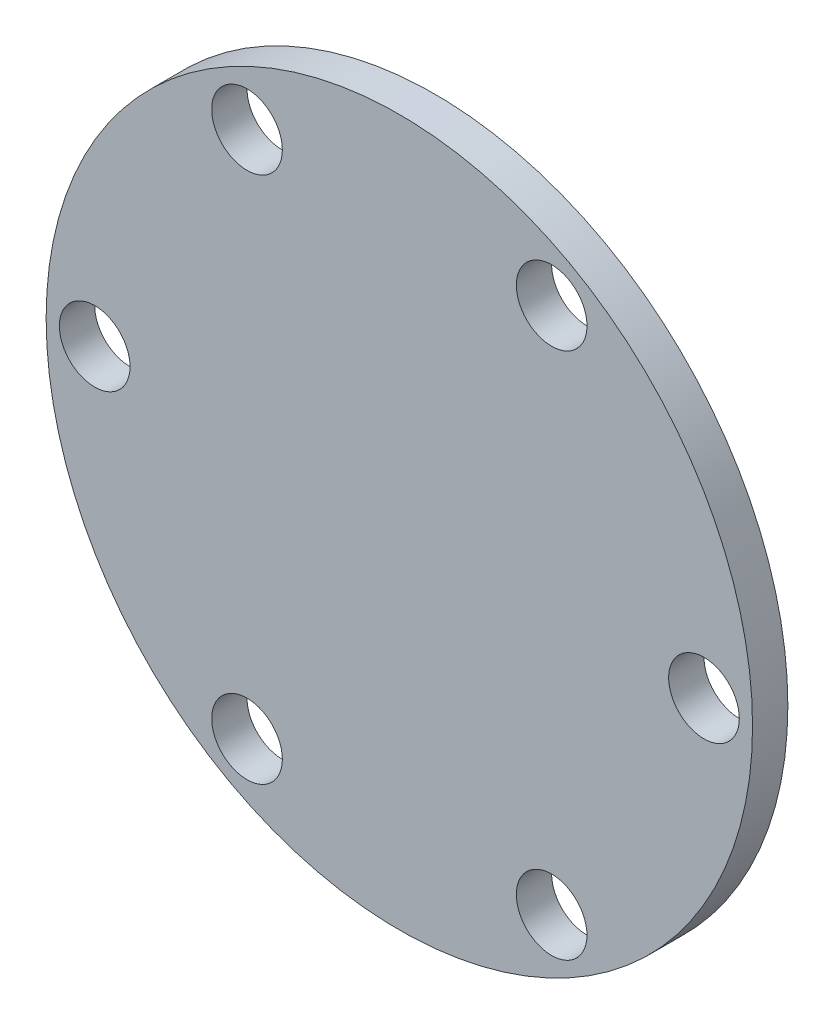
ISO-10303-21;
HEADER;
FILE_DESCRIPTION(('STEP AP214'),'2;1');
FILE_NAME('part.step','',(''),(''),'','','');
FILE_SCHEMA(('AUTOMOTIVE_DESIGN { 1 0 10303 214 1 1 1 1 }'));
ENDSEC;
DATA;
#1=APPLICATION_CONTEXT('core data for automotive mechanical design processes');
#2=APPLICATION_PROTOCOL_DEFINITION('international standard','automotive_design',2000,#1);
#3=PRODUCT_CONTEXT('',#1,'mechanical');
#4=PRODUCT('Part','Part','',(#3));
#5=PRODUCT_RELATED_PRODUCT_CATEGORY('part','',(#4));
#6=PRODUCT_DEFINITION_FORMATION('','',#4);
#7=PRODUCT_DEFINITION_CONTEXT('part definition',#1,'design');
#8=PRODUCT_DEFINITION('design','',#6,#7);
#9=PRODUCT_DEFINITION_SHAPE('','',#8);
#10=(LENGTH_UNIT() NAMED_UNIT(*) SI_UNIT(.MILLI.,.METRE.));
#11=(NAMED_UNIT(*) PLANE_ANGLE_UNIT() SI_UNIT($,.RADIAN.));
#12=(NAMED_UNIT(*) SI_UNIT($,.STERADIAN.) SOLID_ANGLE_UNIT());
#13=UNCERTAINTY_MEASURE_WITH_UNIT(LENGTH_MEASURE(1.E-05),#10,'distance_accuracy_value','');
#14=(GEOMETRIC_REPRESENTATION_CONTEXT(3) GLOBAL_UNCERTAINTY_ASSIGNED_CONTEXT((#13)) GLOBAL_UNIT_ASSIGNED_CONTEXT((#10,
#11,#12)) REPRESENTATION_CONTEXT('',''));
#15=CARTESIAN_POINT('',(0.,0.,0.));
#16=DIRECTION('',(0.,0.,1.));
#17=DIRECTION('',(1.,0.,0.));
#18=AXIS2_PLACEMENT_3D('',#15,#16,#17);
#19=CARTESIAN_POINT('',(0.,0.,2.));
#20=DIRECTION('',(0.,0.,1.));
#21=DIRECTION('',(1.,0.,0.));
#22=AXIS2_PLACEMENT_3D('',#19,#20,#21);
#23=PLANE('',#22);
#24=CARTESIAN_POINT('',(-8.62499999999986,14.9389382152816,2.));
#25=DIRECTION('',(0.,0.,1.));
#26=DIRECTION('',(1.,0.,0.));
#27=AXIS2_PLACEMENT_3D('',#24,#25,#26);
#28=CIRCLE('',#27,2.);
#29=CARTESIAN_POINT('',(-6.62499999999986,14.9389382152816,2.));
#30=VERTEX_POINT('',#29);
#31=EDGE_CURVE('E71',#30,#30,#28,.T.);
#32=ORIENTED_EDGE('',*,*,#31,.F.);
#33=EDGE_LOOP('',(#32));
#34=FACE_BOUND('',#33,.T.);
#35=CARTESIAN_POINT('',(-8.62500000000007,-14.9389382152815,2.));
#36=DIRECTION('',(0.,0.,1.));
#37=DIRECTION('',(1.,0.,0.));
#38=AXIS2_PLACEMENT_3D('',#35,#36,#37);
#39=CIRCLE('',#38,2.);
#40=CARTESIAN_POINT('',(-6.62500000000007,-14.9389382152815,2.));
#41=VERTEX_POINT('',#40);
#42=EDGE_CURVE('E59',#41,#41,#39,.T.);
#43=ORIENTED_EDGE('',*,*,#42,.F.);
#44=EDGE_LOOP('',(#43));
#45=FACE_BOUND('',#44,.T.);
#46=CARTESIAN_POINT('',(17.25,0.,2.));
#47=DIRECTION('',(0.,0.,1.));
#48=DIRECTION('',(1.,0.,0.));
#49=AXIS2_PLACEMENT_3D('',#46,#47,#48);
#50=CIRCLE('',#49,2.);
#51=CARTESIAN_POINT('',(19.25,0.,2.));
#52=VERTEX_POINT('',#51);
#53=EDGE_CURVE('E48',#52,#52,#50,.T.);
#54=ORIENTED_EDGE('',*,*,#53,.F.);
#55=EDGE_LOOP('',(#54));
#56=FACE_BOUND('',#55,.T.);
#57=CARTESIAN_POINT('',(0.,0.,2.));
#58=DIRECTION('',(0.,0.,1.));
#59=DIRECTION('',(1.,0.,0.));
#60=AXIS2_PLACEMENT_3D('',#57,#58,#59);
#61=CIRCLE('',#60,20.);
#62=CARTESIAN_POINT('',(20.,0.,2.));
#63=VERTEX_POINT('',#62);
#64=EDGE_CURVE('E10',#63,#63,#61,.T.);
#65=ORIENTED_EDGE('',*,*,#64,.T.);
#66=EDGE_LOOP('',(#65));
#67=FACE_BOUND('',#66,.T.);
#68=CARTESIAN_POINT('',(8.62499999999997,-14.9389382152816,2.));
#69=DIRECTION('',(0.,0.,1.));
#70=DIRECTION('',(1.,0.,0.));
#71=AXIS2_PLACEMENT_3D('',#68,#69,#70);
#72=CIRCLE('',#71,2.);
#73=CARTESIAN_POINT('',(10.625,-14.9389382152816,2.));
#74=VERTEX_POINT('',#73);
#75=EDGE_CURVE('E53',#74,#74,#72,.T.);
#76=ORIENTED_EDGE('',*,*,#75,.F.);
#77=EDGE_LOOP('',(#76));
#78=FACE_BOUND('',#77,.T.);
#79=CARTESIAN_POINT('',(-17.25,1.20456106190088E-13,2.));
#80=DIRECTION('',(0.,0.,1.));
#81=DIRECTION('',(1.,0.,0.));
#82=AXIS2_PLACEMENT_3D('',#79,#80,#81);
#83=CIRCLE('',#82,2.);
#84=CARTESIAN_POINT('',(-15.25,1.20456106190088E-13,2.));
#85=VERTEX_POINT('',#84);
#86=EDGE_CURVE('E65',#85,#85,#83,.T.);
#87=ORIENTED_EDGE('',*,*,#86,.F.);
#88=EDGE_LOOP('',(#87));
#89=FACE_BOUND('',#88,.T.);
#90=CARTESIAN_POINT('',(8.62500000000018,14.9389382152815,2.));
#91=DIRECTION('',(0.,0.,1.));
#92=DIRECTION('',(1.,0.,0.));
#93=AXIS2_PLACEMENT_3D('',#90,#91,#92);
#94=CIRCLE('',#93,2.);
#95=CARTESIAN_POINT('',(10.6250000000002,14.9389382152815,2.));
#96=VERTEX_POINT('',#95);
#97=EDGE_CURVE('E77',#96,#96,#94,.T.);
#98=ORIENTED_EDGE('',*,*,#97,.F.);
#99=EDGE_LOOP('',(#98));
#100=FACE_BOUND('',#99,.T.);
#101=ADVANCED_FACE('F37',(#34,#45,#56,#67,#78,#89,#100),#23,.T.);
#102=CARTESIAN_POINT('',(0.,0.,0.));
#103=DIRECTION('',(0.,0.,1.));
#104=DIRECTION('',(1.,0.,0.));
#105=AXIS2_PLACEMENT_3D('',#102,#103,#104);
#106=PLANE('',#105);
#107=CARTESIAN_POINT('',(0.,0.,0.));
#108=DIRECTION('',(0.,0.,1.));
#109=DIRECTION('',(1.,0.,0.));
#110=AXIS2_PLACEMENT_3D('',#107,#108,#109);
#111=CIRCLE('',#110,20.);
#112=CARTESIAN_POINT('',(20.,0.,0.));
#113=VERTEX_POINT('',#112);
#114=EDGE_CURVE('E41',#113,#113,#111,.T.);
#115=ORIENTED_EDGE('',*,*,#114,.F.);
#116=EDGE_LOOP('',(#115));
#117=FACE_BOUND('',#116,.T.);
#118=CARTESIAN_POINT('',(17.25,0.,0.));
#119=DIRECTION('',(0.,0.,1.));
#120=DIRECTION('',(1.,0.,0.));
#121=AXIS2_PLACEMENT_3D('',#118,#119,#120);
#122=CIRCLE('',#121,2.);
#123=CARTESIAN_POINT('',(19.25,0.,0.));
#124=VERTEX_POINT('',#123);
#125=EDGE_CURVE('E50',#124,#124,#122,.T.);
#126=ORIENTED_EDGE('',*,*,#125,.T.);
#127=EDGE_LOOP('',(#126));
#128=FACE_BOUND('',#127,.T.);
#129=CARTESIAN_POINT('',(8.62499999999997,-14.9389382152816,0.));
#130=DIRECTION('',(0.,0.,1.));
#131=DIRECTION('',(1.,0.,0.));
#132=AXIS2_PLACEMENT_3D('',#129,#130,#131);
#133=CIRCLE('',#132,2.);
#134=CARTESIAN_POINT('',(10.625,-14.9389382152816,0.));
#135=VERTEX_POINT('',#134);
#136=EDGE_CURVE('E56',#135,#135,#133,.T.);
#137=ORIENTED_EDGE('',*,*,#136,.T.);
#138=EDGE_LOOP('',(#137));
#139=FACE_BOUND('',#138,.T.);
#140=CARTESIAN_POINT('',(-8.62500000000007,-14.9389382152815,0.));
#141=DIRECTION('',(0.,0.,1.));
#142=DIRECTION('',(1.,0.,0.));
#143=AXIS2_PLACEMENT_3D('',#140,#141,#142);
#144=CIRCLE('',#143,2.);
#145=CARTESIAN_POINT('',(-6.62500000000007,-14.9389382152815,0.));
#146=VERTEX_POINT('',#145);
#147=EDGE_CURVE('E62',#146,#146,#144,.T.);
#148=ORIENTED_EDGE('',*,*,#147,.T.);
#149=EDGE_LOOP('',(#148));
#150=FACE_BOUND('',#149,.T.);
#151=CARTESIAN_POINT('',(-17.25,1.20456106190088E-13,0.));
#152=DIRECTION('',(0.,0.,1.));
#153=DIRECTION('',(1.,0.,0.));
#154=AXIS2_PLACEMENT_3D('',#151,#152,#153);
#155=CIRCLE('',#154,2.);
#156=CARTESIAN_POINT('',(-15.25,1.20456106190088E-13,0.));
#157=VERTEX_POINT('',#156);
#158=EDGE_CURVE('E68',#157,#157,#155,.T.);
#159=ORIENTED_EDGE('',*,*,#158,.T.);
#160=EDGE_LOOP('',(#159));
#161=FACE_BOUND('',#160,.T.);
#162=CARTESIAN_POINT('',(-8.62499999999986,14.9389382152816,0.));
#163=DIRECTION('',(0.,0.,1.));
#164=DIRECTION('',(1.,0.,0.));
#165=AXIS2_PLACEMENT_3D('',#162,#163,#164);
#166=CIRCLE('',#165,2.);
#167=CARTESIAN_POINT('',(-6.62499999999986,14.9389382152816,0.));
#168=VERTEX_POINT('',#167);
#169=EDGE_CURVE('E74',#168,#168,#166,.T.);
#170=ORIENTED_EDGE('',*,*,#169,.T.);
#171=EDGE_LOOP('',(#170));
#172=FACE_BOUND('',#171,.T.);
#173=CARTESIAN_POINT('',(8.62500000000018,14.9389382152815,0.));
#174=DIRECTION('',(0.,0.,1.));
#175=DIRECTION('',(1.,0.,0.));
#176=AXIS2_PLACEMENT_3D('',#173,#174,#175);
#177=CIRCLE('',#176,2.);
#178=CARTESIAN_POINT('',(10.6250000000002,14.9389382152815,0.));
#179=VERTEX_POINT('',#178);
#180=EDGE_CURVE('E80',#179,#179,#177,.T.);
#181=ORIENTED_EDGE('',*,*,#180,.T.);
#182=EDGE_LOOP('',(#181));
#183=FACE_BOUND('',#182,.T.);
#184=ADVANCED_FACE('F90',(#117,#128,#139,#150,#161,#172,#183),#106,.F.);
#185=CARTESIAN_POINT('',(0.,0.,2.));
#186=DIRECTION('',(0.,0.,-1.));
#187=DIRECTION('',(-1.,0.,0.));
#188=AXIS2_PLACEMENT_3D('',#185,#186,#187);
#189=CYLINDRICAL_SURFACE('',#188,20.);
#190=ORIENTED_EDGE('',*,*,#64,.F.);
#191=EDGE_LOOP('',(#190));
#192=FACE_BOUND('',#191,.T.);
#193=ORIENTED_EDGE('',*,*,#114,.T.);
#194=EDGE_LOOP('',(#193));
#195=FACE_BOUND('',#194,.T.);
#196=ADVANCED_FACE('F39',(#192,#195),#189,.T.);
#197=CARTESIAN_POINT('',(17.25,0.,2.));
#198=DIRECTION('',(0.,0.,-1.));
#199=DIRECTION('',(-1.,0.,0.));
#200=AXIS2_PLACEMENT_3D('',#197,#198,#199);
#201=CYLINDRICAL_SURFACE('',#200,2.);
#202=ORIENTED_EDGE('',*,*,#53,.T.);
#203=EDGE_LOOP('',(#202));
#204=FACE_BOUND('',#203,.T.);
#205=ORIENTED_EDGE('',*,*,#125,.F.);
#206=EDGE_LOOP('',(#205));
#207=FACE_BOUND('',#206,.T.);
#208=ADVANCED_FACE('F100',(#204,#207),#201,.F.);
#209=CARTESIAN_POINT('',(8.62499999999997,-14.9389382152816,2.));
#210=DIRECTION('',(0.,0.,-1.));
#211=DIRECTION('',(-1.,0.,0.));
#212=AXIS2_PLACEMENT_3D('',#209,#210,#211);
#213=CYLINDRICAL_SURFACE('',#212,2.);
#214=ORIENTED_EDGE('',*,*,#75,.T.);
#215=EDGE_LOOP('',(#214));
#216=FACE_BOUND('',#215,.T.);
#217=ORIENTED_EDGE('',*,*,#136,.F.);
#218=EDGE_LOOP('',(#217));
#219=FACE_BOUND('',#218,.T.);
#220=ADVANCED_FACE('F103',(#216,#219),#213,.F.);
#221=CARTESIAN_POINT('',(-8.62500000000007,-14.9389382152815,2.));
#222=DIRECTION('',(0.,0.,-1.));
#223=DIRECTION('',(-1.,0.,0.));
#224=AXIS2_PLACEMENT_3D('',#221,#222,#223);
#225=CYLINDRICAL_SURFACE('',#224,2.);
#226=ORIENTED_EDGE('',*,*,#42,.T.);
#227=EDGE_LOOP('',(#226));
#228=FACE_BOUND('',#227,.T.);
#229=ORIENTED_EDGE('',*,*,#147,.F.);
#230=EDGE_LOOP('',(#229));
#231=FACE_BOUND('',#230,.T.);
#232=ADVANCED_FACE('F107',(#228,#231),#225,.F.);
#233=CARTESIAN_POINT('',(-17.25,1.20456106190088E-13,2.));
#234=DIRECTION('',(0.,0.,-1.));
#235=DIRECTION('',(-1.,0.,0.));
#236=AXIS2_PLACEMENT_3D('',#233,#234,#235);
#237=CYLINDRICAL_SURFACE('',#236,2.);
#238=ORIENTED_EDGE('',*,*,#86,.T.);
#239=EDGE_LOOP('',(#238));
#240=FACE_BOUND('',#239,.T.);
#241=ORIENTED_EDGE('',*,*,#158,.F.);
#242=EDGE_LOOP('',(#241));
#243=FACE_BOUND('',#242,.T.);
#244=ADVANCED_FACE('F111',(#240,#243),#237,.F.);
#245=CARTESIAN_POINT('',(-8.62499999999986,14.9389382152816,2.));
#246=DIRECTION('',(0.,0.,-1.));
#247=DIRECTION('',(-1.,0.,0.));
#248=AXIS2_PLACEMENT_3D('',#245,#246,#247);
#249=CYLINDRICAL_SURFACE('',#248,2.);
#250=ORIENTED_EDGE('',*,*,#31,.T.);
#251=EDGE_LOOP('',(#250));
#252=FACE_BOUND('',#251,.T.);
#253=ORIENTED_EDGE('',*,*,#169,.F.);
#254=EDGE_LOOP('',(#253));
#255=FACE_BOUND('',#254,.T.);
#256=ADVANCED_FACE('F115',(#252,#255),#249,.F.);
#257=CARTESIAN_POINT('',(8.62500000000018,14.9389382152815,2.));
#258=DIRECTION('',(0.,0.,-1.));
#259=DIRECTION('',(-1.,0.,0.));
#260=AXIS2_PLACEMENT_3D('',#257,#258,#259);
#261=CYLINDRICAL_SURFACE('',#260,2.);
#262=ORIENTED_EDGE('',*,*,#97,.T.);
#263=EDGE_LOOP('',(#262));
#264=FACE_BOUND('',#263,.T.);
#265=ORIENTED_EDGE('',*,*,#180,.F.);
#266=EDGE_LOOP('',(#265));
#267=FACE_BOUND('',#266,.T.);
#268=ADVANCED_FACE('F86',(#264,#267),#261,.F.);
#269=CLOSED_SHELL('',(#101,#184,#196,#208,#220,#232,#244,#256,#268));
#270=MANIFOLD_SOLID_BREP('B2',#269);
#271=ADVANCED_BREP_SHAPE_REPRESENTATION('',(#18,#270),#14);
#272=SHAPE_DEFINITION_REPRESENTATION(#9,#271);
ENDSEC;
END-ISO-10303-21;
